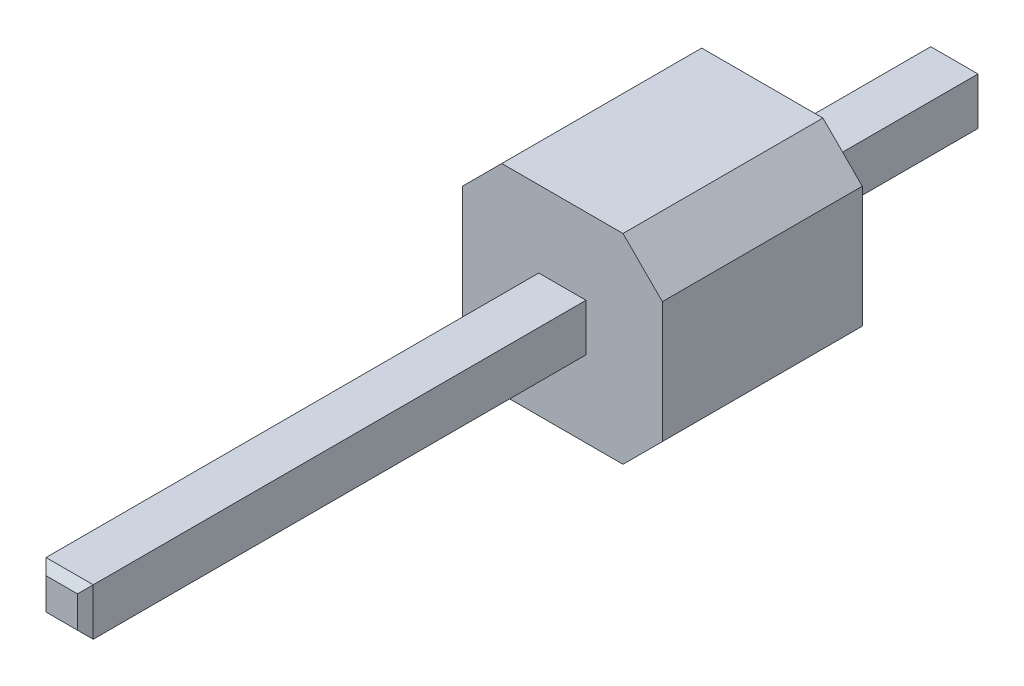
ISO-10303-21;
HEADER;
FILE_DESCRIPTION(('STEP AP214'),'2;1');
FILE_NAME('part.step','',(''),(''),'','','');
FILE_SCHEMA(('AUTOMOTIVE_DESIGN { 1 0 10303 214 1 1 1 1 }'));
ENDSEC;
DATA;
#1=APPLICATION_CONTEXT('core data for automotive mechanical design processes');
#2=APPLICATION_PROTOCOL_DEFINITION('international standard','automotive_design',2000,#1);
#3=PRODUCT_CONTEXT('',#1,'mechanical');
#4=PRODUCT('Part','Part','',(#3));
#5=PRODUCT_RELATED_PRODUCT_CATEGORY('part','',(#4));
#6=PRODUCT_DEFINITION_FORMATION('','',#4);
#7=PRODUCT_DEFINITION_CONTEXT('part definition',#1,'design');
#8=PRODUCT_DEFINITION('design','',#6,#7);
#9=PRODUCT_DEFINITION_SHAPE('','',#8);
#10=(LENGTH_UNIT() NAMED_UNIT(*) SI_UNIT(.MILLI.,.METRE.));
#11=(NAMED_UNIT(*) PLANE_ANGLE_UNIT() SI_UNIT($,.RADIAN.));
#12=(NAMED_UNIT(*) SI_UNIT($,.STERADIAN.) SOLID_ANGLE_UNIT());
#13=UNCERTAINTY_MEASURE_WITH_UNIT(LENGTH_MEASURE(1.E-05),#10,'distance_accuracy_value','');
#14=(GEOMETRIC_REPRESENTATION_CONTEXT(3) GLOBAL_UNCERTAINTY_ASSIGNED_CONTEXT((#13)) GLOBAL_UNIT_ASSIGNED_CONTEXT((#10,
#11,#12)) REPRESENTATION_CONTEXT('',''));
#15=CARTESIAN_POINT('',(0.,0.,0.));
#16=DIRECTION('',(0.,0.,1.));
#17=DIRECTION('',(1.,0.,0.));
#18=AXIS2_PLACEMENT_3D('',#15,#16,#17);
#19=CARTESIAN_POINT('',(-0.769999999999999,1.27,2.54));
#20=DIRECTION('',(0.707106781186546,-0.707106781186549,0.));
#21=DIRECTION('',(0.707106781186549,0.707106781186546,0.));
#22=AXIS2_PLACEMENT_3D('',#19,#20,#21);
#23=PLANE('',#22);
#24=DIRECTION('',(-0.707106781186549,-0.707106781186546,0.));
#25=VECTOR('',#24,1.);
#26=CARTESIAN_POINT('',(-0.769999999999999,1.27,0.));
#27=LINE('',#26,#25);
#28=CARTESIAN_POINT('',(-0.769999999999999,1.27,0.));
#29=VERTEX_POINT('',#28);
#30=CARTESIAN_POINT('',(-1.27,0.77,0.));
#31=VERTEX_POINT('',#30);
#32=EDGE_CURVE('E195',#29,#31,#27,.T.);
#33=ORIENTED_EDGE('',*,*,#32,.T.);
#34=DIRECTION('',(0.,0.,-1.));
#35=VECTOR('',#34,1.);
#36=CARTESIAN_POINT('',(-1.27,0.77,2.54));
#37=LINE('',#36,#35);
#38=CARTESIAN_POINT('',(-1.27,0.77,2.54));
#39=VERTEX_POINT('',#38);
#40=EDGE_CURVE('E264',#39,#31,#37,.T.);
#41=ORIENTED_EDGE('',*,*,#40,.F.);
#42=DIRECTION('',(-0.707106781186549,-0.707106781186546,0.));
#43=VECTOR('',#42,1.);
#44=CARTESIAN_POINT('',(-0.769999999999999,1.27,2.54));
#45=LINE('',#44,#43);
#46=CARTESIAN_POINT('',(-0.769999999999999,1.27,2.54));
#47=VERTEX_POINT('',#46);
#48=EDGE_CURVE('E210',#47,#39,#45,.T.);
#49=ORIENTED_EDGE('',*,*,#48,.F.);
#50=DIRECTION('',(0.,0.,-1.));
#51=VECTOR('',#50,1.);
#52=CARTESIAN_POINT('',(-0.769999999999999,1.27,2.54));
#53=LINE('',#52,#51);
#54=EDGE_CURVE('E228',#47,#29,#53,.T.);
#55=ORIENTED_EDGE('',*,*,#54,.T.);
#56=EDGE_LOOP('',(#33,#41,#49,#55));
#57=FACE_BOUND('',#56,.T.);
#58=ADVANCED_FACE('F36',(#57),#23,.F.);
#59=CARTESIAN_POINT('',(-1.27,0.77,2.54));
#60=DIRECTION('',(1.,0.,0.));
#61=DIRECTION('',(0.,1.,0.));
#62=AXIS2_PLACEMENT_3D('',#59,#60,#61);
#63=PLANE('',#62);
#64=DIRECTION('',(0.,-1.,0.));
#65=VECTOR('',#64,1.);
#66=CARTESIAN_POINT('',(-1.27,0.77,0.));
#67=LINE('',#66,#65);
#68=CARTESIAN_POINT('',(-1.27,-0.770000000000001,0.));
#69=VERTEX_POINT('',#68);
#70=EDGE_CURVE('E231',#31,#69,#67,.T.);
#71=ORIENTED_EDGE('',*,*,#70,.T.);
#72=DIRECTION('',(0.,0.,-1.));
#73=VECTOR('',#72,1.);
#74=CARTESIAN_POINT('',(-1.27,-0.770000000000001,2.54));
#75=LINE('',#74,#73);
#76=CARTESIAN_POINT('',(-1.27,-0.770000000000001,2.54));
#77=VERTEX_POINT('',#76);
#78=EDGE_CURVE('E261',#77,#69,#75,.T.);
#79=ORIENTED_EDGE('',*,*,#78,.F.);
#80=DIRECTION('',(0.,-1.,0.));
#81=VECTOR('',#80,1.);
#82=CARTESIAN_POINT('',(-1.27,0.77,2.54));
#83=LINE('',#82,#81);
#84=EDGE_CURVE('E213',#39,#77,#83,.T.);
#85=ORIENTED_EDGE('',*,*,#84,.F.);
#86=ORIENTED_EDGE('',*,*,#40,.T.);
#87=EDGE_LOOP('',(#71,#79,#85,#86));
#88=FACE_BOUND('',#87,.T.);
#89=ADVANCED_FACE('F398',(#88),#63,.F.);
#90=CARTESIAN_POINT('',(-0.769999999999999,-1.27,2.54));
#91=DIRECTION('',(0.707106781186546,0.707106781186549,0.));
#92=DIRECTION('',(-0.707106781186549,0.707106781186546,0.));
#93=AXIS2_PLACEMENT_3D('',#90,#91,#92);
#94=PLANE('',#93);
#95=DIRECTION('',(0.707106781186549,-0.707106781186546,0.));
#96=VECTOR('',#95,1.);
#97=CARTESIAN_POINT('',(-0.769999999999999,-1.27,0.));
#98=LINE('',#97,#96);
#99=CARTESIAN_POINT('',(-0.769999999999999,-1.27,0.));
#100=VERTEX_POINT('',#99);
#101=EDGE_CURVE('E233',#69,#100,#98,.T.);
#102=ORIENTED_EDGE('',*,*,#101,.T.);
#103=DIRECTION('',(0.,0.,-1.));
#104=VECTOR('',#103,1.);
#105=CARTESIAN_POINT('',(-0.769999999999999,-1.27,2.54));
#106=LINE('',#105,#104);
#107=CARTESIAN_POINT('',(-0.769999999999999,-1.27,2.54));
#108=VERTEX_POINT('',#107);
#109=EDGE_CURVE('E258',#108,#100,#106,.T.);
#110=ORIENTED_EDGE('',*,*,#109,.F.);
#111=DIRECTION('',(0.707106781186549,-0.707106781186546,0.));
#112=VECTOR('',#111,1.);
#113=CARTESIAN_POINT('',(-0.769999999999999,-1.27,2.54));
#114=LINE('',#113,#112);
#115=EDGE_CURVE('E216',#77,#108,#114,.T.);
#116=ORIENTED_EDGE('',*,*,#115,.F.);
#117=ORIENTED_EDGE('',*,*,#78,.T.);
#118=EDGE_LOOP('',(#102,#110,#116,#117));
#119=FACE_BOUND('',#118,.T.);
#120=ADVANCED_FACE('F404',(#119),#94,.F.);
#121=CARTESIAN_POINT('',(-0.769999999999999,-1.27,2.54));
#122=DIRECTION('',(0.,1.,0.));
#123=DIRECTION('',(0.,0.,1.));
#124=AXIS2_PLACEMENT_3D('',#121,#122,#123);
#125=PLANE('',#124);
#126=DIRECTION('',(1.,0.,0.));
#127=VECTOR('',#126,1.);
#128=CARTESIAN_POINT('',(-0.769999999999999,-1.27,0.));
#129=LINE('',#128,#127);
#130=CARTESIAN_POINT('',(0.769999999999999,-1.27,0.));
#131=VERTEX_POINT('',#130);
#132=EDGE_CURVE('E235',#100,#131,#129,.T.);
#133=ORIENTED_EDGE('',*,*,#132,.T.);
#134=DIRECTION('',(0.,0.,-1.));
#135=VECTOR('',#134,1.);
#136=CARTESIAN_POINT('',(0.769999999999999,-1.27,2.54));
#137=LINE('',#136,#135);
#138=CARTESIAN_POINT('',(0.769999999999999,-1.27,2.54));
#139=VERTEX_POINT('',#138);
#140=EDGE_CURVE('E255',#139,#131,#137,.T.);
#141=ORIENTED_EDGE('',*,*,#140,.F.);
#142=DIRECTION('',(1.,0.,0.));
#143=VECTOR('',#142,1.);
#144=CARTESIAN_POINT('',(-0.769999999999999,-1.27,2.54));
#145=LINE('',#144,#143);
#146=EDGE_CURVE('E218',#108,#139,#145,.T.);
#147=ORIENTED_EDGE('',*,*,#146,.F.);
#148=ORIENTED_EDGE('',*,*,#109,.T.);
#149=EDGE_LOOP('',(#133,#141,#147,#148));
#150=FACE_BOUND('',#149,.T.);
#151=ADVANCED_FACE('F565',(#150),#125,.F.);
#152=CARTESIAN_POINT('',(0.769999999999999,-1.27,2.54));
#153=DIRECTION('',(-0.707106781186546,0.707106781186549,0.));
#154=DIRECTION('',(-0.707106781186549,-0.707106781186546,0.));
#155=AXIS2_PLACEMENT_3D('',#152,#153,#154);
#156=PLANE('',#155);
#157=DIRECTION('',(0.707106781186549,0.707106781186546,0.));
#158=VECTOR('',#157,1.);
#159=CARTESIAN_POINT('',(0.769999999999999,-1.27,0.));
#160=LINE('',#159,#158);
#161=CARTESIAN_POINT('',(1.27,-0.770000000000001,0.));
#162=VERTEX_POINT('',#161);
#163=EDGE_CURVE('E237',#131,#162,#160,.T.);
#164=ORIENTED_EDGE('',*,*,#163,.T.);
#165=DIRECTION('',(0.,0.,-1.));
#166=VECTOR('',#165,1.);
#167=CARTESIAN_POINT('',(1.27,-0.770000000000001,2.54));
#168=LINE('',#167,#166);
#169=CARTESIAN_POINT('',(1.27,-0.770000000000001,2.54));
#170=VERTEX_POINT('',#169);
#171=EDGE_CURVE('E252',#170,#162,#168,.T.);
#172=ORIENTED_EDGE('',*,*,#171,.F.);
#173=DIRECTION('',(0.707106781186549,0.707106781186546,0.));
#174=VECTOR('',#173,1.);
#175=CARTESIAN_POINT('',(0.769999999999999,-1.27,2.54));
#176=LINE('',#175,#174);
#177=EDGE_CURVE('E220',#139,#170,#176,.T.);
#178=ORIENTED_EDGE('',*,*,#177,.F.);
#179=ORIENTED_EDGE('',*,*,#140,.T.);
#180=EDGE_LOOP('',(#164,#172,#178,#179));
#181=FACE_BOUND('',#180,.T.);
#182=ADVANCED_FACE('F555',(#181),#156,.F.);
#183=CARTESIAN_POINT('',(1.27,0.77,2.54));
#184=DIRECTION('',(-1.,0.,0.));
#185=DIRECTION('',(0.,-1.,0.));
#186=AXIS2_PLACEMENT_3D('',#183,#184,#185);
#187=PLANE('',#186);
#188=DIRECTION('',(0.,1.,0.));
#189=VECTOR('',#188,1.);
#190=CARTESIAN_POINT('',(1.27,0.77,0.));
#191=LINE('',#190,#189);
#192=CARTESIAN_POINT('',(1.27,0.77,0.));
#193=VERTEX_POINT('',#192);
#194=EDGE_CURVE('E239',#162,#193,#191,.T.);
#195=ORIENTED_EDGE('',*,*,#194,.T.);
#196=DIRECTION('',(0.,0.,-1.));
#197=VECTOR('',#196,1.);
#198=CARTESIAN_POINT('',(1.27,0.77,2.54));
#199=LINE('',#198,#197);
#200=CARTESIAN_POINT('',(1.27,0.77,2.54));
#201=VERTEX_POINT('',#200);
#202=EDGE_CURVE('E249',#201,#193,#199,.T.);
#203=ORIENTED_EDGE('',*,*,#202,.F.);
#204=DIRECTION('',(0.,1.,0.));
#205=VECTOR('',#204,1.);
#206=CARTESIAN_POINT('',(1.27,0.77,2.54));
#207=LINE('',#206,#205);
#208=EDGE_CURVE('E222',#170,#201,#207,.T.);
#209=ORIENTED_EDGE('',*,*,#208,.F.);
#210=ORIENTED_EDGE('',*,*,#171,.T.);
#211=EDGE_LOOP('',(#195,#203,#209,#210));
#212=FACE_BOUND('',#211,.T.);
#213=ADVANCED_FACE('F545',(#212),#187,.F.);
#214=CARTESIAN_POINT('',(0.769999999999999,1.27,2.54));
#215=DIRECTION('',(-0.707106781186546,-0.707106781186549,0.));
#216=DIRECTION('',(0.707106781186549,-0.707106781186546,0.));
#217=AXIS2_PLACEMENT_3D('',#214,#215,#216);
#218=PLANE('',#217);
#219=DIRECTION('',(-0.707106781186549,0.707106781186546,0.));
#220=VECTOR('',#219,1.);
#221=CARTESIAN_POINT('',(0.769999999999999,1.27,0.));
#222=LINE('',#221,#220);
#223=CARTESIAN_POINT('',(0.769999999999999,1.27,0.));
#224=VERTEX_POINT('',#223);
#225=EDGE_CURVE('E241',#193,#224,#222,.T.);
#226=ORIENTED_EDGE('',*,*,#225,.T.);
#227=DIRECTION('',(0.,0.,-1.));
#228=VECTOR('',#227,1.);
#229=CARTESIAN_POINT('',(0.769999999999999,1.27,2.54));
#230=LINE('',#229,#228);
#231=CARTESIAN_POINT('',(0.769999999999999,1.27,2.54));
#232=VERTEX_POINT('',#231);
#233=EDGE_CURVE('E246',#232,#224,#230,.T.);
#234=ORIENTED_EDGE('',*,*,#233,.F.);
#235=DIRECTION('',(-0.707106781186549,0.707106781186546,0.));
#236=VECTOR('',#235,1.);
#237=CARTESIAN_POINT('',(0.769999999999999,1.27,2.54));
#238=LINE('',#237,#236);
#239=EDGE_CURVE('E224',#201,#232,#238,.T.);
#240=ORIENTED_EDGE('',*,*,#239,.F.);
#241=ORIENTED_EDGE('',*,*,#202,.T.);
#242=EDGE_LOOP('',(#226,#234,#240,#241));
#243=FACE_BOUND('',#242,.T.);
#244=ADVANCED_FACE('F535',(#243),#218,.F.);
#245=CARTESIAN_POINT('',(-0.769999999999999,1.27,2.54));
#246=DIRECTION('',(0.,-1.,0.));
#247=DIRECTION('',(0.,0.,-1.));
#248=AXIS2_PLACEMENT_3D('',#245,#246,#247);
#249=PLANE('',#248);
#250=DIRECTION('',(-1.,0.,0.));
#251=VECTOR('',#250,1.);
#252=CARTESIAN_POINT('',(-0.769999999999999,1.27,0.));
#253=LINE('',#252,#251);
#254=EDGE_CURVE('E214',#224,#29,#253,.T.);
#255=ORIENTED_EDGE('',*,*,#254,.T.);
#256=ORIENTED_EDGE('',*,*,#54,.F.);
#257=DIRECTION('',(-1.,0.,0.));
#258=VECTOR('',#257,1.);
#259=CARTESIAN_POINT('',(-0.769999999999999,1.27,2.54));
#260=LINE('',#259,#258);
#261=EDGE_CURVE('E226',#232,#47,#260,.T.);
#262=ORIENTED_EDGE('',*,*,#261,.F.);
#263=ORIENTED_EDGE('',*,*,#233,.T.);
#264=EDGE_LOOP('',(#255,#256,#262,#263));
#265=FACE_BOUND('',#264,.T.);
#266=ADVANCED_FACE('F526',(#265),#249,.F.);
#267=CARTESIAN_POINT('',(0.,0.,2.54));
#268=DIRECTION('',(0.,0.,-1.));
#269=DIRECTION('',(-1.,0.,0.));
#270=AXIS2_PLACEMENT_3D('',#267,#268,#269);
#271=PLANE('',#270);
#272=DIRECTION('',(-1.,0.,0.));
#273=VECTOR('',#272,1.);
#274=CARTESIAN_POINT('',(0.,0.3,2.54));
#275=LINE('',#274,#273);
#276=CARTESIAN_POINT('',(0.3,0.3,2.54));
#277=VERTEX_POINT('',#276);
#278=CARTESIAN_POINT('',(-0.3,0.3,2.54));
#279=VERTEX_POINT('',#278);
#280=EDGE_CURVE('E196',#277,#279,#275,.T.);
#281=ORIENTED_EDGE('',*,*,#280,.F.);
#282=DIRECTION('',(0.,-1.,0.));
#283=VECTOR('',#282,1.);
#284=CARTESIAN_POINT('',(0.3,0.,2.54));
#285=LINE('',#284,#283);
#286=CARTESIAN_POINT('',(0.3,-0.3,2.54));
#287=VERTEX_POINT('',#286);
#288=EDGE_CURVE('E194',#277,#287,#285,.T.);
#289=ORIENTED_EDGE('',*,*,#288,.T.);
#290=DIRECTION('',(1.,0.,0.));
#291=VECTOR('',#290,1.);
#292=CARTESIAN_POINT('',(0.,-0.3,2.54));
#293=LINE('',#292,#291);
#294=CARTESIAN_POINT('',(-0.3,-0.3,2.54));
#295=VERTEX_POINT('',#294);
#296=EDGE_CURVE('E177',#295,#287,#293,.T.);
#297=ORIENTED_EDGE('',*,*,#296,.F.);
#298=DIRECTION('',(0.,-1.,0.));
#299=VECTOR('',#298,1.);
#300=CARTESIAN_POINT('',(-0.3,0.,2.54));
#301=LINE('',#300,#299);
#302=EDGE_CURVE('E191',#279,#295,#301,.T.);
#303=ORIENTED_EDGE('',*,*,#302,.F.);
#304=EDGE_LOOP('',(#281,#289,#297,#303));
#305=FACE_BOUND('',#304,.T.);
#306=ORIENTED_EDGE('',*,*,#48,.T.);
#307=ORIENTED_EDGE('',*,*,#84,.T.);
#308=ORIENTED_EDGE('',*,*,#115,.T.);
#309=ORIENTED_EDGE('',*,*,#146,.T.);
#310=ORIENTED_EDGE('',*,*,#177,.T.);
#311=ORIENTED_EDGE('',*,*,#208,.T.);
#312=ORIENTED_EDGE('',*,*,#239,.T.);
#313=ORIENTED_EDGE('',*,*,#261,.T.);
#314=EDGE_LOOP('',(#306,#307,#308,#309,#310,#311,#312,#313));
#315=FACE_BOUND('',#314,.T.);
#316=ADVANCED_FACE('F189',(#305,#315),#271,.F.);
#317=CARTESIAN_POINT('',(0.,0.,0.));
#318=DIRECTION('',(0.,0.,-1.));
#319=DIRECTION('',(-1.,0.,0.));
#320=AXIS2_PLACEMENT_3D('',#317,#318,#319);
#321=PLANE('',#320);
#322=DIRECTION('',(0.,-1.,0.));
#323=VECTOR('',#322,1.);
#324=CARTESIAN_POINT('',(0.3,0.,0.));
#325=LINE('',#324,#323);
#326=CARTESIAN_POINT('',(0.3,0.3,0.));
#327=VERTEX_POINT('',#326);
#328=CARTESIAN_POINT('',(0.3,-0.3,0.));
#329=VERTEX_POINT('',#328);
#330=EDGE_CURVE('E276',#327,#329,#325,.T.);
#331=ORIENTED_EDGE('',*,*,#330,.F.);
#332=DIRECTION('',(-1.,0.,0.));
#333=VECTOR('',#332,1.);
#334=CARTESIAN_POINT('',(0.,0.3,0.));
#335=LINE('',#334,#333);
#336=CARTESIAN_POINT('',(-0.3,0.3,0.));
#337=VERTEX_POINT('',#336);
#338=EDGE_CURVE('E270',#327,#337,#335,.T.);
#339=ORIENTED_EDGE('',*,*,#338,.T.);
#340=DIRECTION('',(0.,-1.,0.));
#341=VECTOR('',#340,1.);
#342=CARTESIAN_POINT('',(-0.3,0.,0.));
#343=LINE('',#342,#341);
#344=CARTESIAN_POINT('',(-0.3,-0.3,0.));
#345=VERTEX_POINT('',#344);
#346=EDGE_CURVE('E267',#337,#345,#343,.T.);
#347=ORIENTED_EDGE('',*,*,#346,.T.);
#348=DIRECTION('',(1.,0.,0.));
#349=VECTOR('',#348,1.);
#350=CARTESIAN_POINT('',(0.,-0.3,0.));
#351=LINE('',#350,#349);
#352=EDGE_CURVE('E273',#345,#329,#351,.T.);
#353=ORIENTED_EDGE('',*,*,#352,.T.);
#354=EDGE_LOOP('',(#331,#339,#347,#353));
#355=FACE_BOUND('',#354,.T.);
#356=ORIENTED_EDGE('',*,*,#32,.F.);
#357=ORIENTED_EDGE('',*,*,#254,.F.);
#358=ORIENTED_EDGE('',*,*,#225,.F.);
#359=ORIENTED_EDGE('',*,*,#194,.F.);
#360=ORIENTED_EDGE('',*,*,#163,.F.);
#361=ORIENTED_EDGE('',*,*,#132,.F.);
#362=ORIENTED_EDGE('',*,*,#101,.F.);
#363=ORIENTED_EDGE('',*,*,#70,.F.);
#364=EDGE_LOOP('',(#356,#357,#358,#359,#360,#361,#362,#363));
#365=FACE_BOUND('',#364,.T.);
#366=ADVANCED_FACE('F354',(#355,#365),#321,.T.);
#367=CARTESIAN_POINT('',(0.3,-0.3,-2.54));
#368=DIRECTION('',(0.,0.,1.));
#369=DIRECTION('',(1.,0.,0.));
#370=AXIS2_PLACEMENT_3D('',#367,#368,#369);
#371=PLANE('',#370);
#372=DIRECTION('',(1.,0.,0.));
#373=VECTOR('',#372,1.);
#374=CARTESIAN_POINT('',(0.3,0.200000000000001,-2.54));
#375=LINE('',#374,#373);
#376=CARTESIAN_POINT('',(-0.200000000000001,0.200000000000001,-2.54));
#377=VERTEX_POINT('',#376);
#378=CARTESIAN_POINT('',(0.200000000000001,0.200000000000001,-2.54));
#379=VERTEX_POINT('',#378);
#380=EDGE_CURVE('E297',#377,#379,#375,.T.);
#381=ORIENTED_EDGE('',*,*,#380,.T.);
#382=DIRECTION('',(0.,-1.,0.));
#383=VECTOR('',#382,1.);
#384=CARTESIAN_POINT('',(0.200000000000001,-0.3,-2.54));
#385=LINE('',#384,#383);
#386=CARTESIAN_POINT('',(0.200000000000001,-0.200000000000001,-2.54));
#387=VERTEX_POINT('',#386);
#388=EDGE_CURVE('E303',#379,#387,#385,.T.);
#389=ORIENTED_EDGE('',*,*,#388,.T.);
#390=DIRECTION('',(-1.,0.,0.));
#391=VECTOR('',#390,1.);
#392=CARTESIAN_POINT('',(0.3,-0.200000000000001,-2.54));
#393=LINE('',#392,#391);
#394=CARTESIAN_POINT('',(-0.200000000000001,-0.200000000000001,-2.54));
#395=VERTEX_POINT('',#394);
#396=EDGE_CURVE('E301',#387,#395,#393,.T.);
#397=ORIENTED_EDGE('',*,*,#396,.T.);
#398=DIRECTION('',(0.,1.,0.));
#399=VECTOR('',#398,1.);
#400=CARTESIAN_POINT('',(-0.200000000000001,-0.3,-2.54));
#401=LINE('',#400,#399);
#402=EDGE_CURVE('E299',#395,#377,#401,.T.);
#403=ORIENTED_EDGE('',*,*,#402,.T.);
#404=EDGE_LOOP('',(#381,#389,#397,#403));
#405=FACE_BOUND('',#404,.T.);
#406=ADVANCED_FACE('F337',(#405),#371,.F.);
#407=CARTESIAN_POINT('',(-0.3,0.,0.));
#408=DIRECTION('',(1.,0.,0.));
#409=DIRECTION('',(0.,0.,-1.));
#410=AXIS2_PLACEMENT_3D('',#407,#408,#409);
#411=PLANE('',#410);
#412=DIRECTION('',(0.,0.,1.));
#413=VECTOR('',#412,1.);
#414=CARTESIAN_POINT('',(-0.3,0.3,8.9));
#415=LINE('',#414,#413);
#416=CARTESIAN_POINT('',(-0.3,0.3,-2.44));
#417=VERTEX_POINT('',#416);
#418=EDGE_CURVE('E207',#417,#337,#415,.T.);
#419=ORIENTED_EDGE('',*,*,#418,.F.);
#420=DIRECTION('',(0.,-1.,0.));
#421=VECTOR('',#420,1.);
#422=CARTESIAN_POINT('',(-0.3,0.,-2.44));
#423=LINE('',#422,#421);
#424=CARTESIAN_POINT('',(-0.3,-0.3,-2.44));
#425=VERTEX_POINT('',#424);
#426=EDGE_CURVE('E45',#417,#425,#423,.T.);
#427=ORIENTED_EDGE('',*,*,#426,.T.);
#428=DIRECTION('',(0.,0.,-1.));
#429=VECTOR('',#428,1.);
#430=CARTESIAN_POINT('',(-0.3,-0.3,8.9));
#431=LINE('',#430,#429);
#432=EDGE_CURVE('E185',#345,#425,#431,.T.);
#433=ORIENTED_EDGE('',*,*,#432,.F.);
#434=ORIENTED_EDGE('',*,*,#346,.F.);
#435=EDGE_LOOP('',(#419,#427,#433,#434));
#436=FACE_BOUND('',#435,.T.);
#437=ADVANCED_FACE('F395',(#436),#411,.F.);
#438=CARTESIAN_POINT('',(0.3,0.,0.));
#439=DIRECTION('',(1.,0.,0.));
#440=DIRECTION('',(0.,0.,-1.));
#441=AXIS2_PLACEMENT_3D('',#438,#439,#440);
#442=PLANE('',#441);
#443=DIRECTION('',(0.,0.,-1.));
#444=VECTOR('',#443,1.);
#445=CARTESIAN_POINT('',(0.3,-0.3,8.9));
#446=LINE('',#445,#444);
#447=CARTESIAN_POINT('',(0.3,-0.3,-2.44));
#448=VERTEX_POINT('',#447);
#449=EDGE_CURVE('E349',#329,#448,#446,.T.);
#450=ORIENTED_EDGE('',*,*,#449,.T.);
#451=DIRECTION('',(0.,1.,0.));
#452=VECTOR('',#451,1.);
#453=CARTESIAN_POINT('',(0.3,0.3,-2.44));
#454=LINE('',#453,#452);
#455=CARTESIAN_POINT('',(0.3,0.3,-2.44));
#456=VERTEX_POINT('',#455);
#457=EDGE_CURVE('E294',#448,#456,#454,.T.);
#458=ORIENTED_EDGE('',*,*,#457,.T.);
#459=DIRECTION('',(0.,0.,1.));
#460=VECTOR('',#459,1.);
#461=CARTESIAN_POINT('',(0.3,0.3,8.9));
#462=LINE('',#461,#460);
#463=EDGE_CURVE('E201',#456,#327,#462,.T.);
#464=ORIENTED_EDGE('',*,*,#463,.T.);
#465=ORIENTED_EDGE('',*,*,#330,.T.);
#466=EDGE_LOOP('',(#450,#458,#464,#465));
#467=FACE_BOUND('',#466,.T.);
#468=ADVANCED_FACE('F346',(#467),#442,.T.);
#469=CARTESIAN_POINT('',(0.3,0.3,8.9));
#470=DIRECTION('',(0.,-1.,0.));
#471=DIRECTION('',(0.,0.,-1.));
#472=AXIS2_PLACEMENT_3D('',#469,#470,#471);
#473=PLANE('',#472);
#474=ORIENTED_EDGE('',*,*,#463,.F.);
#475=DIRECTION('',(-1.,0.,0.));
#476=VECTOR('',#475,1.);
#477=CARTESIAN_POINT('',(0.3,0.3,-2.44));
#478=LINE('',#477,#476);
#479=EDGE_CURVE('E11',#456,#417,#478,.T.);
#480=ORIENTED_EDGE('',*,*,#479,.T.);
#481=ORIENTED_EDGE('',*,*,#418,.T.);
#482=ORIENTED_EDGE('',*,*,#338,.F.);
#483=EDGE_LOOP('',(#474,#480,#481,#482));
#484=FACE_BOUND('',#483,.T.);
#485=ADVANCED_FACE('F350',(#484),#473,.F.);
#486=CARTESIAN_POINT('',(0.3,-0.3,8.9));
#487=DIRECTION('',(0.,1.,0.));
#488=DIRECTION('',(0.,0.,1.));
#489=AXIS2_PLACEMENT_3D('',#486,#487,#488);
#490=PLANE('',#489);
#491=ORIENTED_EDGE('',*,*,#432,.T.);
#492=DIRECTION('',(1.,0.,0.));
#493=VECTOR('',#492,1.);
#494=CARTESIAN_POINT('',(0.3,-0.3,-2.44));
#495=LINE('',#494,#493);
#496=EDGE_CURVE('E306',#425,#448,#495,.T.);
#497=ORIENTED_EDGE('',*,*,#496,.T.);
#498=ORIENTED_EDGE('',*,*,#449,.F.);
#499=ORIENTED_EDGE('',*,*,#352,.F.);
#500=EDGE_LOOP('',(#491,#497,#498,#499));
#501=FACE_BOUND('',#500,.T.);
#502=ADVANCED_FACE('F358',(#501),#490,.F.);
#503=CARTESIAN_POINT('',(0.3,-0.3,8.8));
#504=VERTEX_POINT('',#503);
#505=EDGE_CURVE('E359',#504,#287,#446,.T.);
#506=ORIENTED_EDGE('',*,*,#505,.F.);
#507=DIRECTION('',(-1.,0.,0.));
#508=VECTOR('',#507,1.);
#509=CARTESIAN_POINT('',(0.3,-0.3,8.8));
#510=LINE('',#509,#508);
#511=CARTESIAN_POINT('',(-0.3,-0.3,8.8));
#512=VERTEX_POINT('',#511);
#513=EDGE_CURVE('E179',#504,#512,#510,.T.);
#514=ORIENTED_EDGE('',*,*,#513,.T.);
#515=EDGE_CURVE('E173',#512,#295,#431,.T.);
#516=ORIENTED_EDGE('',*,*,#515,.T.);
#517=ORIENTED_EDGE('',*,*,#296,.T.);
#518=EDGE_LOOP('',(#506,#514,#516,#517));
#519=FACE_BOUND('',#518,.T.);
#520=ADVANCED_FACE('F176',(#519),#490,.F.);
#521=CARTESIAN_POINT('',(-0.3,0.3,8.8));
#522=VERTEX_POINT('',#521);
#523=EDGE_CURVE('E184',#279,#522,#415,.T.);
#524=ORIENTED_EDGE('',*,*,#523,.T.);
#525=DIRECTION('',(1.,0.,0.));
#526=VECTOR('',#525,1.);
#527=CARTESIAN_POINT('',(0.3,0.3,8.8));
#528=LINE('',#527,#526);
#529=CARTESIAN_POINT('',(0.3,0.3,8.8));
#530=VERTEX_POINT('',#529);
#531=EDGE_CURVE('E289',#522,#530,#528,.T.);
#532=ORIENTED_EDGE('',*,*,#531,.T.);
#533=EDGE_CURVE('E204',#277,#530,#462,.T.);
#534=ORIENTED_EDGE('',*,*,#533,.F.);
#535=ORIENTED_EDGE('',*,*,#280,.T.);
#536=EDGE_LOOP('',(#524,#532,#534,#535));
#537=FACE_BOUND('',#536,.T.);
#538=ADVANCED_FACE('F362',(#537),#473,.F.);
#539=ORIENTED_EDGE('',*,*,#533,.T.);
#540=DIRECTION('',(0.,-1.,0.));
#541=VECTOR('',#540,1.);
#542=CARTESIAN_POINT('',(0.3,-0.3,8.8));
#543=LINE('',#542,#541);
#544=EDGE_CURVE('E291',#530,#504,#543,.T.);
#545=ORIENTED_EDGE('',*,*,#544,.T.);
#546=ORIENTED_EDGE('',*,*,#505,.T.);
#547=ORIENTED_EDGE('',*,*,#288,.F.);
#548=EDGE_LOOP('',(#539,#545,#546,#547));
#549=FACE_BOUND('',#548,.T.);
#550=ADVANCED_FACE('F367',(#549),#442,.T.);
#551=ORIENTED_EDGE('',*,*,#515,.F.);
#552=DIRECTION('',(0.,1.,0.));
#553=VECTOR('',#552,1.);
#554=CARTESIAN_POINT('',(-0.3,0.,8.8));
#555=LINE('',#554,#553);
#556=EDGE_CURVE('E287',#512,#522,#555,.T.);
#557=ORIENTED_EDGE('',*,*,#556,.T.);
#558=ORIENTED_EDGE('',*,*,#523,.F.);
#559=ORIENTED_EDGE('',*,*,#302,.T.);
#560=EDGE_LOOP('',(#551,#557,#558,#559));
#561=FACE_BOUND('',#560,.T.);
#562=ADVANCED_FACE('F199',(#561),#411,.F.);
#563=CARTESIAN_POINT('',(0.3,0.3,8.9));
#564=DIRECTION('',(0.,0.,-1.));
#565=DIRECTION('',(0.,1.,0.));
#566=AXIS2_PLACEMENT_3D('',#563,#564,#565);
#567=PLANE('',#566);
#568=DIRECTION('',(-1.,0.,0.));
#569=VECTOR('',#568,1.);
#570=CARTESIAN_POINT('',(0.3,0.200000000000001,8.9));
#571=LINE('',#570,#569);
#572=CARTESIAN_POINT('',(0.200000000000001,0.200000000000001,8.9));
#573=VERTEX_POINT('',#572);
#574=CARTESIAN_POINT('',(-0.200000000000001,0.200000000000001,8.9));
#575=VERTEX_POINT('',#574);
#576=EDGE_CURVE('E282',#573,#575,#571,.T.);
#577=ORIENTED_EDGE('',*,*,#576,.T.);
#578=DIRECTION('',(0.,-1.,0.));
#579=VECTOR('',#578,1.);
#580=CARTESIAN_POINT('',(-0.200000000000001,0.3,8.9));
#581=LINE('',#580,#579);
#582=CARTESIAN_POINT('',(-0.200000000000001,-0.200000000000001,8.9));
#583=VERTEX_POINT('',#582);
#584=EDGE_CURVE('E284',#575,#583,#581,.T.);
#585=ORIENTED_EDGE('',*,*,#584,.T.);
#586=DIRECTION('',(1.,0.,0.));
#587=VECTOR('',#586,1.);
#588=CARTESIAN_POINT('',(0.3,-0.200000000000001,8.9));
#589=LINE('',#588,#587);
#590=CARTESIAN_POINT('',(0.200000000000001,-0.200000000000001,8.9));
#591=VERTEX_POINT('',#590);
#592=EDGE_CURVE('E278',#583,#591,#589,.T.);
#593=ORIENTED_EDGE('',*,*,#592,.T.);
#594=DIRECTION('',(0.,1.,0.));
#595=VECTOR('',#594,1.);
#596=CARTESIAN_POINT('',(0.200000000000001,0.3,8.9));
#597=LINE('',#596,#595);
#598=EDGE_CURVE('E280',#591,#573,#597,.T.);
#599=ORIENTED_EDGE('',*,*,#598,.T.);
#600=EDGE_LOOP('',(#577,#585,#593,#599));
#601=FACE_BOUND('',#600,.T.);
#602=ADVANCED_FACE('F386',(#601),#567,.F.);
#603=CARTESIAN_POINT('',(0.3,0.,8.8));
#604=DIRECTION('',(0.707106781186545,0.,0.707106781186549));
#605=DIRECTION('',(0.,1.,0.));
#606=AXIS2_PLACEMENT_3D('',#603,#604,#605);
#607=PLANE('',#606);
#608=DIRECTION('',(0.577350269189629,-0.577350269189624,-0.577350269189624));
#609=VECTOR('',#608,1.);
#610=CARTESIAN_POINT('',(0.300000000000001,-0.3,8.8));
#611=LINE('',#610,#609);
#612=EDGE_CURVE('E313',#504,#591,#611,.F.);
#613=ORIENTED_EDGE('',*,*,#612,.F.);
#614=ORIENTED_EDGE('',*,*,#544,.F.);
#615=DIRECTION('',(0.577350269189628,0.577350269189623,-0.577350269189627));
#616=VECTOR('',#615,1.);
#617=CARTESIAN_POINT('',(0.200000000000009,0.200000000000009,8.89999999999999));
#618=LINE('',#617,#616);
#619=EDGE_CURVE('E316',#573,#530,#618,.T.);
#620=ORIENTED_EDGE('',*,*,#619,.F.);
#621=ORIENTED_EDGE('',*,*,#598,.F.);
#622=EDGE_LOOP('',(#613,#614,#620,#621));
#623=FACE_BOUND('',#622,.T.);
#624=ADVANCED_FACE('F372',(#623),#607,.T.);
#625=CARTESIAN_POINT('',(0.3,0.200000000000001,8.9));
#626=DIRECTION('',(0.,-0.70710678118655,-0.707106781186545));
#627=DIRECTION('',(-1.,0.,0.));
#628=AXIS2_PLACEMENT_3D('',#625,#626,#627);
#629=PLANE('',#628);
#630=ORIENTED_EDGE('',*,*,#619,.T.);
#631=ORIENTED_EDGE('',*,*,#531,.F.);
#632=DIRECTION('',(0.577350269189628,-0.577350269189623,0.577350269189626));
#633=VECTOR('',#632,1.);
#634=CARTESIAN_POINT('',(-0.033333333333333,0.0333333333333344,9.06666666666667));
#635=LINE('',#634,#633);
#636=EDGE_CURVE('E311',#575,#522,#635,.F.);
#637=ORIENTED_EDGE('',*,*,#636,.F.);
#638=ORIENTED_EDGE('',*,*,#576,.F.);
#639=EDGE_LOOP('',(#630,#631,#637,#638));
#640=FACE_BOUND('',#639,.T.);
#641=ADVANCED_FACE('F384',(#640),#629,.F.);
#642=CARTESIAN_POINT('',(0.3,-0.3,8.8));
#643=DIRECTION('',(0.,0.707106781186548,-0.707106781186548));
#644=DIRECTION('',(-1.,0.,0.));
#645=AXIS2_PLACEMENT_3D('',#642,#643,#644);
#646=PLANE('',#645);
#647=ORIENTED_EDGE('',*,*,#612,.T.);
#648=ORIENTED_EDGE('',*,*,#592,.F.);
#649=DIRECTION('',(-0.577350269189629,-0.577350269189624,-0.577350269189624));
#650=VECTOR('',#649,1.);
#651=CARTESIAN_POINT('',(-0.0999999999999984,-0.0999999999999991,9.));
#652=LINE('',#651,#650);
#653=EDGE_CURVE('E309',#512,#583,#652,.F.);
#654=ORIENTED_EDGE('',*,*,#653,.F.);
#655=ORIENTED_EDGE('',*,*,#513,.F.);
#656=EDGE_LOOP('',(#647,#648,#654,#655));
#657=FACE_BOUND('',#656,.T.);
#658=ADVANCED_FACE('F377',(#657),#646,.F.);
#659=CARTESIAN_POINT('',(-0.200000000000001,0.3,8.9));
#660=DIRECTION('',(0.707106781186546,0.,-0.707106781186549));
#661=DIRECTION('',(0.,-1.,0.));
#662=AXIS2_PLACEMENT_3D('',#659,#660,#661);
#663=PLANE('',#662);
#664=ORIENTED_EDGE('',*,*,#636,.T.);
#665=ORIENTED_EDGE('',*,*,#556,.F.);
#666=ORIENTED_EDGE('',*,*,#653,.T.);
#667=ORIENTED_EDGE('',*,*,#584,.F.);
#668=EDGE_LOOP('',(#664,#665,#666,#667));
#669=FACE_BOUND('',#668,.T.);
#670=ADVANCED_FACE('F380',(#669),#663,.F.);
#671=CARTESIAN_POINT('',(-0.200000000000001,-0.3,-2.54));
#672=DIRECTION('',(0.707106781186548,0.,0.707106781186548));
#673=DIRECTION('',(0.,1.,0.));
#674=AXIS2_PLACEMENT_3D('',#671,#672,#673);
#675=PLANE('',#674);
#676=DIRECTION('',(-0.577350269189626,0.577350269189626,0.577350269189626));
#677=VECTOR('',#676,1.);
#678=CARTESIAN_POINT('',(-0.1,0.0999999999999999,-2.64));
#679=LINE('',#678,#677);
#680=EDGE_CURVE('E322',#377,#417,#679,.T.);
#681=ORIENTED_EDGE('',*,*,#680,.F.);
#682=ORIENTED_EDGE('',*,*,#402,.F.);
#683=DIRECTION('',(-0.577350269189626,-0.577350269189626,0.577350269189626));
#684=VECTOR('',#683,1.);
#685=CARTESIAN_POINT('',(-0.233333333333334,-0.233333333333334,-2.50666666666667));
#686=LINE('',#685,#684);
#687=EDGE_CURVE('E40',#425,#395,#686,.F.);
#688=ORIENTED_EDGE('',*,*,#687,.F.);
#689=ORIENTED_EDGE('',*,*,#426,.F.);
#690=EDGE_LOOP('',(#681,#682,#688,#689));
#691=FACE_BOUND('',#690,.T.);
#692=ADVANCED_FACE('F38',(#691),#675,.F.);
#693=CARTESIAN_POINT('',(0.3,-0.200000000000001,-2.54));
#694=DIRECTION('',(0.,0.707106781186548,0.707106781186548));
#695=DIRECTION('',(-1.,0.,0.));
#696=AXIS2_PLACEMENT_3D('',#693,#694,#695);
#697=PLANE('',#696);
#698=ORIENTED_EDGE('',*,*,#687,.T.);
#699=ORIENTED_EDGE('',*,*,#396,.F.);
#700=DIRECTION('',(-0.577350269189626,0.577350269189626,-0.577350269189626));
#701=VECTOR('',#700,1.);
#702=CARTESIAN_POINT('',(0.233333333333334,-0.233333333333334,-2.50666666666667));
#703=LINE('',#702,#701);
#704=EDGE_CURVE('E321',#448,#387,#703,.T.);
#705=ORIENTED_EDGE('',*,*,#704,.F.);
#706=ORIENTED_EDGE('',*,*,#496,.F.);
#707=EDGE_LOOP('',(#698,#699,#705,#706));
#708=FACE_BOUND('',#707,.T.);
#709=ADVANCED_FACE('F332',(#708),#697,.F.);
#710=CARTESIAN_POINT('',(0.3,0.3,-2.44));
#711=DIRECTION('',(0.,-0.707106781186548,0.707106781186548));
#712=DIRECTION('',(-1.,0.,0.));
#713=AXIS2_PLACEMENT_3D('',#710,#711,#712);
#714=PLANE('',#713);
#715=ORIENTED_EDGE('',*,*,#680,.T.);
#716=ORIENTED_EDGE('',*,*,#479,.F.);
#717=DIRECTION('',(0.577350269189626,0.577350269189626,0.577350269189626));
#718=VECTOR('',#717,1.);
#719=CARTESIAN_POINT('',(0.3,0.3,-2.44));
#720=LINE('',#719,#718);
#721=EDGE_CURVE('E319',#379,#456,#720,.T.);
#722=ORIENTED_EDGE('',*,*,#721,.F.);
#723=ORIENTED_EDGE('',*,*,#380,.F.);
#724=EDGE_LOOP('',(#715,#716,#722,#723));
#725=FACE_BOUND('',#724,.T.);
#726=ADVANCED_FACE('F343',(#725),#714,.F.);
#727=CARTESIAN_POINT('',(0.3,0.,-2.44));
#728=DIRECTION('',(0.707106781186548,0.,-0.707106781186548));
#729=DIRECTION('',(0.,-1.,0.));
#730=AXIS2_PLACEMENT_3D('',#727,#728,#729);
#731=PLANE('',#730);
#732=ORIENTED_EDGE('',*,*,#704,.T.);
#733=ORIENTED_EDGE('',*,*,#388,.F.);
#734=ORIENTED_EDGE('',*,*,#721,.T.);
#735=ORIENTED_EDGE('',*,*,#457,.F.);
#736=EDGE_LOOP('',(#732,#733,#734,#735));
#737=FACE_BOUND('',#736,.T.);
#738=ADVANCED_FACE('F341',(#737),#731,.T.);
#739=CLOSED_SHELL('',(#58,#89,#120,#151,#182,#213,#244,#266,#316,#366,#406,#437,#468,#485,#502,
#520,#538,#550,#562,#602,#624,#641,#658,#670,#692,#709,#726,#738));
#740=MANIFOLD_SOLID_BREP('B2',#739);
#741=ADVANCED_BREP_SHAPE_REPRESENTATION('',(#18,#740),#14);
#742=SHAPE_DEFINITION_REPRESENTATION(#9,#741);
ENDSEC;
END-ISO-10303-21;
